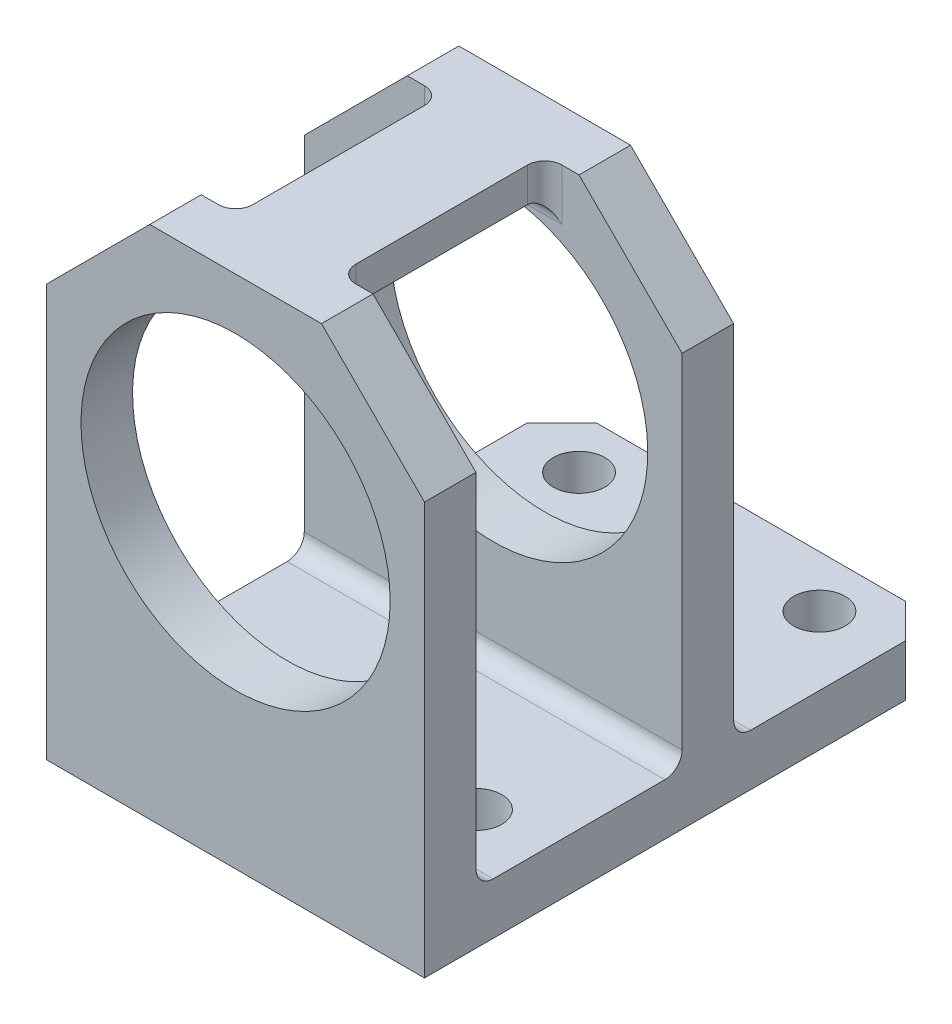
ISO-10303-21;
HEADER;
FILE_DESCRIPTION(('STEP AP214'),'2;1');
FILE_NAME('part.step','',(''),(''),'','','');
FILE_SCHEMA(('AUTOMOTIVE_DESIGN { 1 0 10303 214 1 1 1 1 }'));
ENDSEC;
DATA;
#1=APPLICATION_CONTEXT('core data for automotive mechanical design processes');
#2=APPLICATION_PROTOCOL_DEFINITION('international standard','automotive_design',2000,#1);
#3=PRODUCT_CONTEXT('',#1,'mechanical');
#4=PRODUCT('Part','Part','',(#3));
#5=PRODUCT_RELATED_PRODUCT_CATEGORY('part','',(#4));
#6=PRODUCT_DEFINITION_FORMATION('','',#4);
#7=PRODUCT_DEFINITION_CONTEXT('part definition',#1,'design');
#8=PRODUCT_DEFINITION('design','',#6,#7);
#9=PRODUCT_DEFINITION_SHAPE('','',#8);
#10=(LENGTH_UNIT() NAMED_UNIT(*) SI_UNIT(.MILLI.,.METRE.));
#11=(NAMED_UNIT(*) PLANE_ANGLE_UNIT() SI_UNIT($,.RADIAN.));
#12=(NAMED_UNIT(*) SI_UNIT($,.STERADIAN.) SOLID_ANGLE_UNIT());
#13=UNCERTAINTY_MEASURE_WITH_UNIT(LENGTH_MEASURE(1.E-05),#10,'distance_accuracy_value','');
#14=(GEOMETRIC_REPRESENTATION_CONTEXT(3) GLOBAL_UNCERTAINTY_ASSIGNED_CONTEXT((#13)) GLOBAL_UNIT_ASSIGNED_CONTEXT((#10,
#11,#12)) REPRESENTATION_CONTEXT('',''));
#15=CARTESIAN_POINT('',(0.,0.,0.));
#16=DIRECTION('',(0.,0.,1.));
#17=DIRECTION('',(1.,0.,0.));
#18=AXIS2_PLACEMENT_3D('',#15,#16,#17);
#19=CARTESIAN_POINT('',(11.,-18.,30.));
#20=DIRECTION('',(-1.,0.,0.));
#21=DIRECTION('',(0.,-1.,0.));
#22=AXIS2_PLACEMENT_3D('',#19,#20,#21);
#23=PLANE('',#22);
#24=DIRECTION('',(0.,-1.,0.));
#25=VECTOR('',#24,1.);
#26=CARTESIAN_POINT('',(11.,-15.,12.));
#27=LINE('',#26,#25);
#28=CARTESIAN_POINT('',(11.,5.99999999999999,12.));
#29=VERTEX_POINT('',#28);
#30=CARTESIAN_POINT('',(11.,-14.,12.));
#31=VERTEX_POINT('',#30);
#32=EDGE_CURVE('E423',#29,#31,#27,.T.);
#33=ORIENTED_EDGE('',*,*,#32,.F.);
#34=DIRECTION('',(0.,0.,1.));
#35=VECTOR('',#34,1.);
#36=CARTESIAN_POINT('',(11.,5.99999999999998,30.));
#37=LINE('',#36,#35);
#38=CARTESIAN_POINT('',(11.,5.99999999999998,15.));
#39=VERTEX_POINT('',#38);
#40=EDGE_CURVE('E319',#29,#39,#37,.T.);
#41=ORIENTED_EDGE('',*,*,#40,.T.);
#42=DIRECTION('',(0.,1.,0.));
#43=VECTOR('',#42,1.);
#44=CARTESIAN_POINT('',(11.,10.,15.));
#45=LINE('',#44,#43);
#46=CARTESIAN_POINT('',(11.,-14.,15.));
#47=VERTEX_POINT('',#46);
#48=EDGE_CURVE('E446',#47,#39,#45,.T.);
#49=ORIENTED_EDGE('',*,*,#48,.F.);
#50=CARTESIAN_POINT('',(11.,-14.,16.));
#51=DIRECTION('',(-1.,0.,0.));
#52=DIRECTION('',(0.,-1.,0.));
#53=AXIS2_PLACEMENT_3D('',#50,#51,#52);
#54=CIRCLE('',#53,1.);
#55=CARTESIAN_POINT('',(11.,-15.,16.));
#56=VERTEX_POINT('',#55);
#57=EDGE_CURVE('E378',#47,#56,#54,.T.);
#58=ORIENTED_EDGE('',*,*,#57,.T.);
#59=DIRECTION('',(0.,0.,-1.));
#60=VECTOR('',#59,1.);
#61=CARTESIAN_POINT('',(11.,-15.,27.));
#62=LINE('',#61,#60);
#63=CARTESIAN_POINT('',(11.,-15.,26.));
#64=VERTEX_POINT('',#63);
#65=EDGE_CURVE('E451',#64,#56,#62,.T.);
#66=ORIENTED_EDGE('',*,*,#65,.F.);
#67=CARTESIAN_POINT('',(11.,-14.,26.));
#68=DIRECTION('',(-1.,0.,0.));
#69=DIRECTION('',(0.,-1.,0.));
#70=AXIS2_PLACEMENT_3D('',#67,#68,#69);
#71=CIRCLE('',#70,1.);
#72=CARTESIAN_POINT('',(11.,-14.,27.));
#73=VERTEX_POINT('',#72);
#74=EDGE_CURVE('E44',#64,#73,#71,.T.);
#75=ORIENTED_EDGE('',*,*,#74,.T.);
#76=DIRECTION('',(0.,-1.,0.));
#77=VECTOR('',#76,1.);
#78=CARTESIAN_POINT('',(11.,10.,27.));
#79=LINE('',#78,#77);
#80=CARTESIAN_POINT('',(11.,5.99999999999998,27.));
#81=VERTEX_POINT('',#80);
#82=EDGE_CURVE('E442',#81,#73,#79,.T.);
#83=ORIENTED_EDGE('',*,*,#82,.F.);
#84=DIRECTION('',(0.,0.,1.));
#85=VECTOR('',#84,1.);
#86=CARTESIAN_POINT('',(11.,5.99999999999998,30.));
#87=LINE('',#86,#85);
#88=CARTESIAN_POINT('',(11.,5.99999999999998,30.));
#89=VERTEX_POINT('',#88);
#90=EDGE_CURVE('E317',#81,#89,#87,.T.);
#91=ORIENTED_EDGE('',*,*,#90,.T.);
#92=DIRECTION('',(0.,1.,0.));
#93=VECTOR('',#92,1.);
#94=CARTESIAN_POINT('',(11.,-18.,30.));
#95=LINE('',#94,#93);
#96=CARTESIAN_POINT('',(11.,-18.,30.));
#97=VERTEX_POINT('',#96);
#98=EDGE_CURVE('E254',#97,#89,#95,.T.);
#99=ORIENTED_EDGE('',*,*,#98,.F.);
#100=DIRECTION('',(0.,0.,-1.));
#101=VECTOR('',#100,1.);
#102=CARTESIAN_POINT('',(11.,-18.,30.));
#103=LINE('',#102,#101);
#104=CARTESIAN_POINT('',(11.,-18.,1.99999999999999));
#105=VERTEX_POINT('',#104);
#106=EDGE_CURVE('E243',#97,#105,#103,.T.);
#107=ORIENTED_EDGE('',*,*,#106,.T.);
#108=DIRECTION('',(0.,1.,0.));
#109=VECTOR('',#108,1.);
#110=CARTESIAN_POINT('',(11.,-15.,2.));
#111=LINE('',#110,#109);
#112=CARTESIAN_POINT('',(11.,-15.,1.99999999999999));
#113=VERTEX_POINT('',#112);
#114=EDGE_CURVE('E283',#105,#113,#111,.T.);
#115=ORIENTED_EDGE('',*,*,#114,.T.);
#116=DIRECTION('',(0.,0.,-1.));
#117=VECTOR('',#116,1.);
#118=CARTESIAN_POINT('',(11.,-15.,12.));
#119=LINE('',#118,#117);
#120=CARTESIAN_POINT('',(11.,-15.,11.));
#121=VERTEX_POINT('',#120);
#122=EDGE_CURVE('E427',#121,#113,#119,.T.);
#123=ORIENTED_EDGE('',*,*,#122,.F.);
#124=CARTESIAN_POINT('',(11.,-14.,11.));
#125=DIRECTION('',(-1.,0.,0.));
#126=DIRECTION('',(0.,-1.,0.));
#127=AXIS2_PLACEMENT_3D('',#124,#125,#126);
#128=CIRCLE('',#127,1.);
#129=EDGE_CURVE('E366',#121,#31,#128,.T.);
#130=ORIENTED_EDGE('',*,*,#129,.T.);
#131=EDGE_LOOP('',(#33,#41,#49,#58,#66,#75,#83,#91,#99,#107,#115,#123,#130));
#132=FACE_BOUND('',#131,.T.);
#133=ADVANCED_FACE('F35',(#132),#23,.F.);
#134=CARTESIAN_POINT('',(-11.,12.,30.));
#135=DIRECTION('',(0.,-1.,0.));
#136=DIRECTION('',(0.,0.,-1.));
#137=AXIS2_PLACEMENT_3D('',#134,#135,#136);
#138=PLANE('',#137);
#139=DIRECTION('',(-1.,0.,0.));
#140=VECTOR('',#139,1.);
#141=CARTESIAN_POINT('',(-11.,12.,12.));
#142=LINE('',#141,#140);
#143=CARTESIAN_POINT('',(5.,12.,12.));
#144=VERTEX_POINT('',#143);
#145=CARTESIAN_POINT('',(-4.99999999999997,12.,12.));
#146=VERTEX_POINT('',#145);
#147=EDGE_CURVE('E267',#144,#146,#142,.T.);
#148=ORIENTED_EDGE('',*,*,#147,.T.);
#149=DIRECTION('',(0.,0.,1.));
#150=VECTOR('',#149,1.);
#151=CARTESIAN_POINT('',(-4.99999999999997,12.,30.));
#152=LINE('',#151,#150);
#153=CARTESIAN_POINT('',(-4.99999999999997,12.,15.));
#154=VERTEX_POINT('',#153);
#155=EDGE_CURVE('E303',#146,#154,#152,.T.);
#156=ORIENTED_EDGE('',*,*,#155,.T.);
#157=DIRECTION('',(1.,0.,0.));
#158=VECTOR('',#157,1.);
#159=CARTESIAN_POINT('',(0.,12.,15.));
#160=LINE('',#159,#158);
#161=CARTESIAN_POINT('',(-4.,12.,15.));
#162=VERTEX_POINT('',#161);
#163=EDGE_CURVE('E525',#154,#162,#160,.T.);
#164=ORIENTED_EDGE('',*,*,#163,.T.);
#165=CARTESIAN_POINT('',(-4.,12.,16.));
#166=DIRECTION('',(0.,-1.,0.));
#167=DIRECTION('',(0.,0.,-1.));
#168=AXIS2_PLACEMENT_3D('',#165,#166,#167);
#169=CIRCLE('',#168,1.);
#170=CARTESIAN_POINT('',(-3.,12.,16.));
#171=VERTEX_POINT('',#170);
#172=EDGE_CURVE('E372',#162,#171,#169,.T.);
#173=ORIENTED_EDGE('',*,*,#172,.T.);
#174=DIRECTION('',(0.,0.,-1.));
#175=VECTOR('',#174,1.);
#176=CARTESIAN_POINT('',(-3.,12.,0.));
#177=LINE('',#176,#175);
#178=CARTESIAN_POINT('',(-3.,12.,26.));
#179=VERTEX_POINT('',#178);
#180=EDGE_CURVE('E524',#179,#171,#177,.T.);
#181=ORIENTED_EDGE('',*,*,#180,.F.);
#182=CARTESIAN_POINT('',(-4.,12.,26.));
#183=DIRECTION('',(0.,-1.,0.));
#184=DIRECTION('',(0.,0.,-1.));
#185=AXIS2_PLACEMENT_3D('',#182,#183,#184);
#186=CIRCLE('',#185,1.);
#187=CARTESIAN_POINT('',(-4.,12.,27.));
#188=VERTEX_POINT('',#187);
#189=EDGE_CURVE('E370',#179,#188,#186,.T.);
#190=ORIENTED_EDGE('',*,*,#189,.T.);
#191=DIRECTION('',(1.,0.,0.));
#192=VECTOR('',#191,1.);
#193=CARTESIAN_POINT('',(0.,12.,27.));
#194=LINE('',#193,#192);
#195=CARTESIAN_POINT('',(-4.99999999999997,12.,27.));
#196=VERTEX_POINT('',#195);
#197=EDGE_CURVE('E522',#196,#188,#194,.T.);
#198=ORIENTED_EDGE('',*,*,#197,.F.);
#199=DIRECTION('',(0.,0.,1.));
#200=VECTOR('',#199,1.);
#201=CARTESIAN_POINT('',(-4.99999999999997,12.,30.));
#202=LINE('',#201,#200);
#203=CARTESIAN_POINT('',(-4.99999999999997,12.,30.));
#204=VERTEX_POINT('',#203);
#205=EDGE_CURVE('E301',#196,#204,#202,.T.);
#206=ORIENTED_EDGE('',*,*,#205,.T.);
#207=DIRECTION('',(-1.,0.,0.));
#208=VECTOR('',#207,1.);
#209=CARTESIAN_POINT('',(-11.,12.,30.));
#210=LINE('',#209,#208);
#211=CARTESIAN_POINT('',(5.,12.,30.));
#212=VERTEX_POINT('',#211);
#213=EDGE_CURVE('E234',#212,#204,#210,.T.);
#214=ORIENTED_EDGE('',*,*,#213,.F.);
#215=DIRECTION('',(0.,0.,-1.));
#216=VECTOR('',#215,1.);
#217=CARTESIAN_POINT('',(5.,12.,30.));
#218=LINE('',#217,#216);
#219=CARTESIAN_POINT('',(5.,12.,27.));
#220=VERTEX_POINT('',#219);
#221=EDGE_CURVE('E295',#212,#220,#218,.T.);
#222=ORIENTED_EDGE('',*,*,#221,.T.);
#223=DIRECTION('',(-1.,0.,0.));
#224=VECTOR('',#223,1.);
#225=CARTESIAN_POINT('',(0.,12.,27.));
#226=LINE('',#225,#224);
#227=CARTESIAN_POINT('',(4.,12.,27.));
#228=VERTEX_POINT('',#227);
#229=EDGE_CURVE('E429',#220,#228,#226,.T.);
#230=ORIENTED_EDGE('',*,*,#229,.T.);
#231=CARTESIAN_POINT('',(4.,12.,26.));
#232=DIRECTION('',(0.,-1.,0.));
#233=DIRECTION('',(0.,0.,-1.));
#234=AXIS2_PLACEMENT_3D('',#231,#232,#233);
#235=CIRCLE('',#234,1.);
#236=CARTESIAN_POINT('',(3.,12.,26.));
#237=VERTEX_POINT('',#236);
#238=EDGE_CURVE('E376',#228,#237,#235,.T.);
#239=ORIENTED_EDGE('',*,*,#238,.T.);
#240=DIRECTION('',(0.,0.,-1.));
#241=VECTOR('',#240,1.);
#242=CARTESIAN_POINT('',(3.,12.,0.));
#243=LINE('',#242,#241);
#244=CARTESIAN_POINT('',(3.,12.,16.));
#245=VERTEX_POINT('',#244);
#246=EDGE_CURVE('E412',#237,#245,#243,.T.);
#247=ORIENTED_EDGE('',*,*,#246,.T.);
#248=CARTESIAN_POINT('',(4.,12.,16.));
#249=DIRECTION('',(0.,-1.,0.));
#250=DIRECTION('',(0.,0.,-1.));
#251=AXIS2_PLACEMENT_3D('',#248,#249,#250);
#252=CIRCLE('',#251,1.);
#253=CARTESIAN_POINT('',(4.,12.,15.));
#254=VERTEX_POINT('',#253);
#255=EDGE_CURVE('E374',#245,#254,#252,.T.);
#256=ORIENTED_EDGE('',*,*,#255,.T.);
#257=DIRECTION('',(-1.,0.,0.));
#258=VECTOR('',#257,1.);
#259=CARTESIAN_POINT('',(0.,12.,15.));
#260=LINE('',#259,#258);
#261=CARTESIAN_POINT('',(5.,12.,15.));
#262=VERTEX_POINT('',#261);
#263=EDGE_CURVE('E424',#262,#254,#260,.T.);
#264=ORIENTED_EDGE('',*,*,#263,.F.);
#265=DIRECTION('',(0.,0.,-1.));
#266=VECTOR('',#265,1.);
#267=CARTESIAN_POINT('',(5.,12.,30.));
#268=LINE('',#267,#266);
#269=EDGE_CURVE('E298',#262,#144,#268,.T.);
#270=ORIENTED_EDGE('',*,*,#269,.T.);
#271=EDGE_LOOP('',(#148,#156,#164,#173,#181,#190,#198,#206,#214,#222,#230,#239,#247,#256,#264,#270));
#272=FACE_BOUND('',#271,.T.);
#273=ADVANCED_FACE('F418',(#272),#138,.F.);
#274=CARTESIAN_POINT('',(-11.,10.,27.));
#275=DIRECTION('',(0.,1.,0.));
#276=DIRECTION('',(-1.,0.,0.));
#277=AXIS2_PLACEMENT_3D('',#274,#275,#276);
#278=PLANE('',#277);
#279=DIRECTION('',(0.,0.,1.));
#280=VECTOR('',#279,1.);
#281=CARTESIAN_POINT('',(-3.,10.,0.));
#282=LINE('',#281,#280);
#283=CARTESIAN_POINT('',(-3.,10.,16.));
#284=VERTEX_POINT('',#283);
#285=CARTESIAN_POINT('',(-3.,10.,26.));
#286=VERTEX_POINT('',#285);
#287=EDGE_CURVE('E519',#284,#286,#282,.T.);
#288=ORIENTED_EDGE('',*,*,#287,.F.);
#289=DIRECTION('',(1.,0.,0.));
#290=VECTOR('',#289,1.);
#291=CARTESIAN_POINT('',(3.,10.,16.));
#292=LINE('',#291,#290);
#293=CARTESIAN_POINT('',(3.,10.,16.));
#294=VERTEX_POINT('',#293);
#295=EDGE_CURVE('E364',#284,#294,#292,.T.);
#296=ORIENTED_EDGE('',*,*,#295,.T.);
#297=DIRECTION('',(0.,0.,1.));
#298=VECTOR('',#297,1.);
#299=CARTESIAN_POINT('',(3.,10.,0.));
#300=LINE('',#299,#298);
#301=CARTESIAN_POINT('',(3.,10.,26.));
#302=VERTEX_POINT('',#301);
#303=EDGE_CURVE('E415',#294,#302,#300,.T.);
#304=ORIENTED_EDGE('',*,*,#303,.T.);
#305=DIRECTION('',(1.,0.,0.));
#306=VECTOR('',#305,1.);
#307=CARTESIAN_POINT('',(-3.,10.,26.));
#308=LINE('',#307,#306);
#309=EDGE_CURVE('E362',#302,#286,#308,.F.);
#310=ORIENTED_EDGE('',*,*,#309,.T.);
#311=EDGE_LOOP('',(#288,#296,#304,#310));
#312=FACE_BOUND('',#311,.T.);
#313=ADVANCED_FACE('F591',(#312),#278,.F.);
#314=CARTESIAN_POINT('',(0.,0.,30.));
#315=DIRECTION('',(0.,0.,-1.));
#316=DIRECTION('',(-1.,0.,0.));
#317=AXIS2_PLACEMENT_3D('',#314,#315,#316);
#318=CYLINDRICAL_SURFACE('',#317,9.);
#319=CARTESIAN_POINT('',(0.,0.,27.));
#320=DIRECTION('',(0.,0.,1.));
#321=DIRECTION('',(0.,-1.,0.));
#322=AXIS2_PLACEMENT_3D('',#319,#320,#321);
#323=CIRCLE('',#322,9.);
#324=CARTESIAN_POINT('',(0.,9.,27.));
#325=VERTEX_POINT('',#324);
#326=EDGE_CURVE('E260',#325,#325,#323,.T.);
#327=ORIENTED_EDGE('',*,*,#326,.F.);
#328=EDGE_LOOP('',(#327));
#329=FACE_BOUND('',#328,.T.);
#330=CARTESIAN_POINT('',(0.,0.,30.));
#331=DIRECTION('',(0.,0.,1.));
#332=DIRECTION('',(1.,0.,0.));
#333=AXIS2_PLACEMENT_3D('',#330,#331,#332);
#334=CIRCLE('',#333,9.);
#335=CARTESIAN_POINT('',(9.,0.,30.));
#336=VERTEX_POINT('',#335);
#337=EDGE_CURVE('E255',#336,#336,#334,.T.);
#338=ORIENTED_EDGE('',*,*,#337,.T.);
#339=EDGE_LOOP('',(#338));
#340=FACE_BOUND('',#339,.T.);
#341=ADVANCED_FACE('F754',(#329,#340),#318,.F.);
#342=CARTESIAN_POINT('',(0.,0.,30.));
#343=DIRECTION('',(0.,0.,-1.));
#344=DIRECTION('',(-1.,0.,0.));
#345=AXIS2_PLACEMENT_3D('',#342,#343,#344);
#346=PLANE('',#345);
#347=ORIENTED_EDGE('',*,*,#213,.T.);
#348=DIRECTION('',(0.707106781186549,0.707106781186546,0.));
#349=VECTOR('',#348,1.);
#350=CARTESIAN_POINT('',(-11.,6.,30.));
#351=LINE('',#350,#349);
#352=CARTESIAN_POINT('',(-11.,6.,30.));
#353=VERTEX_POINT('',#352);
#354=EDGE_CURVE('E231',#204,#353,#351,.F.);
#355=ORIENTED_EDGE('',*,*,#354,.T.);
#356=DIRECTION('',(0.,-1.,0.));
#357=VECTOR('',#356,1.);
#358=CARTESIAN_POINT('',(-11.,-18.,30.));
#359=LINE('',#358,#357);
#360=CARTESIAN_POINT('',(-11.,-18.,30.));
#361=VERTEX_POINT('',#360);
#362=EDGE_CURVE('E221',#353,#361,#359,.T.);
#363=ORIENTED_EDGE('',*,*,#362,.T.);
#364=DIRECTION('',(1.,0.,0.));
#365=VECTOR('',#364,1.);
#366=CARTESIAN_POINT('',(-11.,-18.,30.));
#367=LINE('',#366,#365);
#368=EDGE_CURVE('E228',#361,#97,#367,.T.);
#369=ORIENTED_EDGE('',*,*,#368,.T.);
#370=ORIENTED_EDGE('',*,*,#98,.T.);
#371=DIRECTION('',(0.707106781186547,-0.707106781186549,0.));
#372=VECTOR('',#371,1.);
#373=CARTESIAN_POINT('',(5.,12.,30.));
#374=LINE('',#373,#372);
#375=EDGE_CURVE('E314',#89,#212,#374,.F.);
#376=ORIENTED_EDGE('',*,*,#375,.T.);
#377=EDGE_LOOP('',(#347,#355,#363,#369,#370,#376));
#378=FACE_BOUND('',#377,.T.);
#379=ORIENTED_EDGE('',*,*,#337,.F.);
#380=EDGE_LOOP('',(#379));
#381=FACE_BOUND('',#380,.T.);
#382=ADVANCED_FACE('F224',(#378,#381),#346,.F.);
#383=CARTESIAN_POINT('',(0.,0.,0.));
#384=DIRECTION('',(0.,0.,-1.));
#385=DIRECTION('',(-1.,0.,0.));
#386=AXIS2_PLACEMENT_3D('',#383,#384,#385);
#387=PLANE('',#386);
#388=DIRECTION('',(1.,0.,0.));
#389=VECTOR('',#388,1.);
#390=CARTESIAN_POINT('',(-11.,-18.,0.));
#391=LINE('',#390,#389);
#392=CARTESIAN_POINT('',(-8.99999999999999,-18.,0.));
#393=VERTEX_POINT('',#392);
#394=CARTESIAN_POINT('',(9.00000000000001,-18.,0.));
#395=VERTEX_POINT('',#394);
#396=EDGE_CURVE('E252',#393,#395,#391,.T.);
#397=ORIENTED_EDGE('',*,*,#396,.F.);
#398=DIRECTION('',(0.,1.,0.));
#399=VECTOR('',#398,1.);
#400=CARTESIAN_POINT('',(-8.99999999999999,-15.,0.));
#401=LINE('',#400,#399);
#402=CARTESIAN_POINT('',(-8.99999999999999,-15.,0.));
#403=VERTEX_POINT('',#402);
#404=EDGE_CURVE('E276',#393,#403,#401,.T.);
#405=ORIENTED_EDGE('',*,*,#404,.T.);
#406=DIRECTION('',(1.,0.,0.));
#407=VECTOR('',#406,1.);
#408=CARTESIAN_POINT('',(-11.,-15.,0.));
#409=LINE('',#408,#407);
#410=CARTESIAN_POINT('',(9.00000000000001,-15.,0.));
#411=VERTEX_POINT('',#410);
#412=EDGE_CURVE('E268',#403,#411,#409,.T.);
#413=ORIENTED_EDGE('',*,*,#412,.T.);
#414=DIRECTION('',(0.,-1.,0.));
#415=VECTOR('',#414,1.);
#416=CARTESIAN_POINT('',(9.00000000000001,-18.,0.));
#417=LINE('',#416,#415);
#418=EDGE_CURVE('E274',#411,#395,#417,.T.);
#419=ORIENTED_EDGE('',*,*,#418,.T.);
#420=EDGE_LOOP('',(#397,#405,#413,#419));
#421=FACE_BOUND('',#420,.T.);
#422=ADVANCED_FACE('F508',(#421),#387,.T.);
#423=CARTESIAN_POINT('',(-11.,-18.,30.));
#424=DIRECTION('',(1.,0.,0.));
#425=DIRECTION('',(0.,1.,0.));
#426=AXIS2_PLACEMENT_3D('',#423,#424,#425);
#427=PLANE('',#426);
#428=DIRECTION('',(0.,0.,-1.));
#429=VECTOR('',#428,1.);
#430=CARTESIAN_POINT('',(-11.,-15.,27.));
#431=LINE('',#430,#429);
#432=CARTESIAN_POINT('',(-11.,-15.,26.));
#433=VERTEX_POINT('',#432);
#434=CARTESIAN_POINT('',(-11.,-15.,16.));
#435=VERTEX_POINT('',#434);
#436=EDGE_CURVE('E445',#433,#435,#431,.T.);
#437=ORIENTED_EDGE('',*,*,#436,.T.);
#438=CARTESIAN_POINT('',(-11.,-14.,16.));
#439=DIRECTION('',(1.,0.,0.));
#440=DIRECTION('',(0.,1.,0.));
#441=AXIS2_PLACEMENT_3D('',#438,#439,#440);
#442=CIRCLE('',#441,1.);
#443=CARTESIAN_POINT('',(-11.,-14.,15.));
#444=VERTEX_POINT('',#443);
#445=EDGE_CURVE('E380',#435,#444,#442,.T.);
#446=ORIENTED_EDGE('',*,*,#445,.T.);
#447=DIRECTION('',(0.,1.,0.));
#448=VECTOR('',#447,1.);
#449=CARTESIAN_POINT('',(-11.,10.,15.));
#450=LINE('',#449,#448);
#451=CARTESIAN_POINT('',(-11.,6.,15.));
#452=VERTEX_POINT('',#451);
#453=EDGE_CURVE('E261',#444,#452,#450,.T.);
#454=ORIENTED_EDGE('',*,*,#453,.T.);
#455=DIRECTION('',(0.,0.,-1.));
#456=VECTOR('',#455,1.);
#457=CARTESIAN_POINT('',(-11.,6.,30.));
#458=LINE('',#457,#456);
#459=CARTESIAN_POINT('',(-11.,6.,12.));
#460=VERTEX_POINT('',#459);
#461=EDGE_CURVE('E288',#452,#460,#458,.T.);
#462=ORIENTED_EDGE('',*,*,#461,.T.);
#463=DIRECTION('',(0.,-1.,0.));
#464=VECTOR('',#463,1.);
#465=CARTESIAN_POINT('',(-11.,-15.,12.));
#466=LINE('',#465,#464);
#467=CARTESIAN_POINT('',(-11.,-14.,12.));
#468=VERTEX_POINT('',#467);
#469=EDGE_CURVE('E433',#460,#468,#466,.T.);
#470=ORIENTED_EDGE('',*,*,#469,.T.);
#471=CARTESIAN_POINT('',(-11.,-14.,11.));
#472=DIRECTION('',(1.,0.,0.));
#473=DIRECTION('',(0.,1.,0.));
#474=AXIS2_PLACEMENT_3D('',#471,#472,#473);
#475=CIRCLE('',#474,1.);
#476=CARTESIAN_POINT('',(-11.,-15.,11.));
#477=VERTEX_POINT('',#476);
#478=EDGE_CURVE('E368',#468,#477,#475,.T.);
#479=ORIENTED_EDGE('',*,*,#478,.T.);
#480=DIRECTION('',(0.,0.,-1.));
#481=VECTOR('',#480,1.);
#482=CARTESIAN_POINT('',(-11.,-15.,12.));
#483=LINE('',#482,#481);
#484=CARTESIAN_POINT('',(-11.,-15.,1.99999999999999));
#485=VERTEX_POINT('',#484);
#486=EDGE_CURVE('E436',#477,#485,#483,.T.);
#487=ORIENTED_EDGE('',*,*,#486,.T.);
#488=DIRECTION('',(0.,-1.,0.));
#489=VECTOR('',#488,1.);
#490=CARTESIAN_POINT('',(-11.,-18.,1.99999999999999));
#491=LINE('',#490,#489);
#492=CARTESIAN_POINT('',(-11.,-18.,1.99999999999999));
#493=VERTEX_POINT('',#492);
#494=EDGE_CURVE('E241',#485,#493,#491,.T.);
#495=ORIENTED_EDGE('',*,*,#494,.T.);
#496=DIRECTION('',(0.,0.,-1.));
#497=VECTOR('',#496,1.);
#498=CARTESIAN_POINT('',(-11.,-18.,30.));
#499=LINE('',#498,#497);
#500=EDGE_CURVE('E238',#361,#493,#499,.T.);
#501=ORIENTED_EDGE('',*,*,#500,.F.);
#502=ORIENTED_EDGE('',*,*,#362,.F.);
#503=DIRECTION('',(0.,0.,-1.));
#504=VECTOR('',#503,1.);
#505=CARTESIAN_POINT('',(-11.,6.,30.));
#506=LINE('',#505,#504);
#507=CARTESIAN_POINT('',(-11.,6.,27.));
#508=VERTEX_POINT('',#507);
#509=EDGE_CURVE('E286',#353,#508,#506,.T.);
#510=ORIENTED_EDGE('',*,*,#509,.T.);
#511=DIRECTION('',(0.,-1.,0.));
#512=VECTOR('',#511,1.);
#513=CARTESIAN_POINT('',(-11.,10.,27.));
#514=LINE('',#513,#512);
#515=CARTESIAN_POINT('',(-11.,-14.,27.));
#516=VERTEX_POINT('',#515);
#517=EDGE_CURVE('E443',#508,#516,#514,.T.);
#518=ORIENTED_EDGE('',*,*,#517,.T.);
#519=CARTESIAN_POINT('',(-11.,-14.,26.));
#520=DIRECTION('',(1.,0.,0.));
#521=DIRECTION('',(0.,1.,0.));
#522=AXIS2_PLACEMENT_3D('',#519,#520,#521);
#523=CIRCLE('',#522,1.);
#524=EDGE_CURVE('E11',#516,#433,#523,.T.);
#525=ORIENTED_EDGE('',*,*,#524,.T.);
#526=EDGE_LOOP('',(#437,#446,#454,#462,#470,#479,#487,#495,#501,#502,#510,#518,#525));
#527=FACE_BOUND('',#526,.T.);
#528=ADVANCED_FACE('F239',(#527),#427,.F.);
#529=CARTESIAN_POINT('',(-11.,-18.,30.));
#530=DIRECTION('',(0.,1.,0.));
#531=DIRECTION('',(0.,0.,1.));
#532=AXIS2_PLACEMENT_3D('',#529,#530,#531);
#533=PLANE('',#532);
#534=CARTESIAN_POINT('',(-7.,-18.,23.));
#535=DIRECTION('',(0.,1.,0.));
#536=DIRECTION('',(1.,0.,0.));
#537=AXIS2_PLACEMENT_3D('',#534,#535,#536);
#538=CIRCLE('',#537,1.5);
#539=CARTESIAN_POINT('',(-5.49999999999999,-18.,23.));
#540=VERTEX_POINT('',#539);
#541=EDGE_CURVE('E548',#540,#540,#538,.T.);
#542=ORIENTED_EDGE('',*,*,#541,.T.);
#543=EDGE_LOOP('',(#542));
#544=FACE_BOUND('',#543,.T.);
#545=CARTESIAN_POINT('',(-7.,-18.,3.));
#546=DIRECTION('',(0.,1.,0.));
#547=DIRECTION('',(1.,0.,0.));
#548=AXIS2_PLACEMENT_3D('',#545,#546,#547);
#549=CIRCLE('',#548,1.5);
#550=CARTESIAN_POINT('',(-5.5,-18.,3.));
#551=VERTEX_POINT('',#550);
#552=EDGE_CURVE('E542',#551,#551,#549,.T.);
#553=ORIENTED_EDGE('',*,*,#552,.T.);
#554=EDGE_LOOP('',(#553));
#555=FACE_BOUND('',#554,.T.);
#556=CARTESIAN_POINT('',(7.,-18.,3.));
#557=DIRECTION('',(0.,1.,0.));
#558=DIRECTION('',(-1.,0.,0.));
#559=AXIS2_PLACEMENT_3D('',#556,#557,#558);
#560=CIRCLE('',#559,1.5);
#561=CARTESIAN_POINT('',(5.50000000000001,-18.,3.));
#562=VERTEX_POINT('',#561);
#563=EDGE_CURVE('E536',#562,#562,#560,.T.);
#564=ORIENTED_EDGE('',*,*,#563,.T.);
#565=EDGE_LOOP('',(#564));
#566=FACE_BOUND('',#565,.T.);
#567=CARTESIAN_POINT('',(7.,-18.,23.));
#568=DIRECTION('',(0.,1.,0.));
#569=DIRECTION('',(-1.,0.,0.));
#570=AXIS2_PLACEMENT_3D('',#567,#568,#569);
#571=CIRCLE('',#570,1.5);
#572=CARTESIAN_POINT('',(5.50000000000001,-18.,23.));
#573=VERTEX_POINT('',#572);
#574=EDGE_CURVE('E530',#573,#573,#571,.T.);
#575=ORIENTED_EDGE('',*,*,#574,.T.);
#576=EDGE_LOOP('',(#575));
#577=FACE_BOUND('',#576,.T.);
#578=ORIENTED_EDGE('',*,*,#500,.T.);
#579=DIRECTION('',(0.707106781186549,0.,-0.707106781186546));
#580=VECTOR('',#579,1.);
#581=CARTESIAN_POINT('',(-11.,-18.,1.99999999999999));
#582=LINE('',#581,#580);
#583=EDGE_CURVE('E272',#493,#393,#582,.T.);
#584=ORIENTED_EDGE('',*,*,#583,.T.);
#585=ORIENTED_EDGE('',*,*,#396,.T.);
#586=DIRECTION('',(0.707106781186549,0.,0.707106781186546));
#587=VECTOR('',#586,1.);
#588=CARTESIAN_POINT('',(11.,-18.,1.99999999999999));
#589=LINE('',#588,#587);
#590=EDGE_CURVE('E270',#395,#105,#589,.T.);
#591=ORIENTED_EDGE('',*,*,#590,.T.);
#592=ORIENTED_EDGE('',*,*,#106,.F.);
#593=ORIENTED_EDGE('',*,*,#368,.F.);
#594=EDGE_LOOP('',(#578,#584,#585,#591,#592,#593));
#595=FACE_BOUND('',#594,.T.);
#596=ADVANCED_FACE('F245',(#544,#555,#566,#577,#595),#533,.F.);
#597=CARTESIAN_POINT('',(0.,0.,12.));
#598=DIRECTION('',(0.,0.,1.));
#599=DIRECTION('',(1.,0.,0.));
#600=AXIS2_PLACEMENT_3D('',#597,#598,#599);
#601=CIRCLE('',#600,9.);
#602=CARTESIAN_POINT('',(9.,0.,12.));
#603=VERTEX_POINT('',#602);
#604=EDGE_CURVE('E264',#603,#603,#601,.T.);
#605=ORIENTED_EDGE('',*,*,#604,.F.);
#606=EDGE_LOOP('',(#605));
#607=FACE_BOUND('',#606,.T.);
#608=CARTESIAN_POINT('',(0.,0.,15.));
#609=DIRECTION('',(0.,0.,-1.));
#610=DIRECTION('',(0.,1.,0.));
#611=AXIS2_PLACEMENT_3D('',#608,#609,#610);
#612=CIRCLE('',#611,9.);
#613=CARTESIAN_POINT('',(0.,9.,15.));
#614=VERTEX_POINT('',#613);
#615=EDGE_CURVE('E257',#614,#614,#612,.T.);
#616=ORIENTED_EDGE('',*,*,#615,.F.);
#617=EDGE_LOOP('',(#616));
#618=FACE_BOUND('',#617,.T.);
#619=ADVANCED_FACE('F743',(#607,#618),#318,.F.);
#620=CARTESIAN_POINT('',(-11.,10.,27.));
#621=DIRECTION('',(0.,0.,1.));
#622=DIRECTION('',(0.,-1.,0.));
#623=AXIS2_PLACEMENT_3D('',#620,#621,#622);
#624=PLANE('',#623);
#625=ORIENTED_EDGE('',*,*,#82,.T.);
#626=DIRECTION('',(1.,0.,0.));
#627=VECTOR('',#626,1.);
#628=CARTESIAN_POINT('',(-11.,-14.,27.));
#629=LINE('',#628,#627);
#630=EDGE_CURVE('E340',#73,#516,#629,.F.);
#631=ORIENTED_EDGE('',*,*,#630,.T.);
#632=ORIENTED_EDGE('',*,*,#517,.F.);
#633=DIRECTION('',(-0.707106781186549,-0.707106781186546,0.));
#634=VECTOR('',#633,1.);
#635=CARTESIAN_POINT('',(-11.,6.,27.));
#636=LINE('',#635,#634);
#637=EDGE_CURVE('E312',#508,#196,#636,.F.);
#638=ORIENTED_EDGE('',*,*,#637,.T.);
#639=ORIENTED_EDGE('',*,*,#197,.T.);
#640=DIRECTION('',(0.,1.,0.));
#641=VECTOR('',#640,1.);
#642=CARTESIAN_POINT('',(-4.,10.,27.));
#643=LINE('',#642,#641);
#644=CARTESIAN_POINT('',(-4.,9.,27.));
#645=VERTEX_POINT('',#644);
#646=EDGE_CURVE('E338',#188,#645,#643,.F.);
#647=ORIENTED_EDGE('',*,*,#646,.T.);
#648=DIRECTION('',(1.,0.,0.));
#649=VECTOR('',#648,1.);
#650=CARTESIAN_POINT('',(3.,9.,27.));
#651=LINE('',#650,#649);
#652=EDGE_CURVE('E334',#645,#325,#651,.T.);
#653=ORIENTED_EDGE('',*,*,#652,.T.);
#654=ORIENTED_EDGE('',*,*,#326,.T.);
#655=DIRECTION('',(1.,0.,0.));
#656=VECTOR('',#655,1.);
#657=CARTESIAN_POINT('',(3.,9.,27.));
#658=LINE('',#657,#656);
#659=CARTESIAN_POINT('',(4.,9.,27.));
#660=VERTEX_POINT('',#659);
#661=EDGE_CURVE('E332',#325,#660,#658,.T.);
#662=ORIENTED_EDGE('',*,*,#661,.T.);
#663=DIRECTION('',(0.,1.,0.));
#664=VECTOR('',#663,1.);
#665=CARTESIAN_POINT('',(4.,10.,27.));
#666=LINE('',#665,#664);
#667=EDGE_CURVE('E336',#660,#228,#666,.T.);
#668=ORIENTED_EDGE('',*,*,#667,.T.);
#669=ORIENTED_EDGE('',*,*,#229,.F.);
#670=DIRECTION('',(-0.707106781186547,0.707106781186549,0.));
#671=VECTOR('',#670,1.);
#672=CARTESIAN_POINT('',(5.,12.,27.));
#673=LINE('',#672,#671);
#674=EDGE_CURVE('E310',#220,#81,#673,.F.);
#675=ORIENTED_EDGE('',*,*,#674,.T.);
#676=EDGE_LOOP('',(#625,#631,#632,#638,#639,#647,#653,#654,#662,#668,#669,#675));
#677=FACE_BOUND('',#676,.T.);
#678=ADVANCED_FACE('F464',(#677),#624,.F.);
#679=CARTESIAN_POINT('',(-11.,10.,15.));
#680=DIRECTION('',(0.,0.,-1.));
#681=DIRECTION('',(0.,1.,0.));
#682=AXIS2_PLACEMENT_3D('',#679,#680,#681);
#683=PLANE('',#682);
#684=ORIENTED_EDGE('',*,*,#453,.F.);
#685=DIRECTION('',(1.,0.,0.));
#686=VECTOR('',#685,1.);
#687=CARTESIAN_POINT('',(11.,-14.,15.));
#688=LINE('',#687,#686);
#689=EDGE_CURVE('E351',#444,#47,#688,.T.);
#690=ORIENTED_EDGE('',*,*,#689,.T.);
#691=ORIENTED_EDGE('',*,*,#48,.T.);
#692=DIRECTION('',(0.707106781186547,-0.707106781186549,0.));
#693=VECTOR('',#692,1.);
#694=CARTESIAN_POINT('',(5.,12.,15.));
#695=LINE('',#694,#693);
#696=EDGE_CURVE('E305',#39,#262,#695,.F.);
#697=ORIENTED_EDGE('',*,*,#696,.T.);
#698=ORIENTED_EDGE('',*,*,#263,.T.);
#699=DIRECTION('',(0.,1.,0.));
#700=VECTOR('',#699,1.);
#701=CARTESIAN_POINT('',(4.,10.,15.));
#702=LINE('',#701,#700);
#703=CARTESIAN_POINT('',(4.,9.,15.));
#704=VERTEX_POINT('',#703);
#705=EDGE_CURVE('E346',#254,#704,#702,.F.);
#706=ORIENTED_EDGE('',*,*,#705,.T.);
#707=DIRECTION('',(1.,0.,0.));
#708=VECTOR('',#707,1.);
#709=CARTESIAN_POINT('',(-3.,9.,15.));
#710=LINE('',#709,#708);
#711=EDGE_CURVE('E344',#704,#614,#710,.F.);
#712=ORIENTED_EDGE('',*,*,#711,.T.);
#713=ORIENTED_EDGE('',*,*,#615,.T.);
#714=DIRECTION('',(1.,0.,0.));
#715=VECTOR('',#714,1.);
#716=CARTESIAN_POINT('',(-3.,9.,15.));
#717=LINE('',#716,#715);
#718=CARTESIAN_POINT('',(-4.,9.,15.));
#719=VERTEX_POINT('',#718);
#720=EDGE_CURVE('E342',#614,#719,#717,.F.);
#721=ORIENTED_EDGE('',*,*,#720,.T.);
#722=DIRECTION('',(0.,1.,0.));
#723=VECTOR('',#722,1.);
#724=CARTESIAN_POINT('',(-4.,12.,15.));
#725=LINE('',#724,#723);
#726=EDGE_CURVE('E348',#719,#162,#725,.T.);
#727=ORIENTED_EDGE('',*,*,#726,.T.);
#728=ORIENTED_EDGE('',*,*,#163,.F.);
#729=DIRECTION('',(0.707106781186549,0.707106781186546,0.));
#730=VECTOR('',#729,1.);
#731=CARTESIAN_POINT('',(-11.,6.,15.));
#732=LINE('',#731,#730);
#733=EDGE_CURVE('E307',#154,#452,#732,.F.);
#734=ORIENTED_EDGE('',*,*,#733,.T.);
#735=EDGE_LOOP('',(#684,#690,#691,#697,#698,#706,#712,#713,#721,#727,#728,#734));
#736=FACE_BOUND('',#735,.T.);
#737=ADVANCED_FACE('F482',(#736),#683,.F.);
#738=CARTESIAN_POINT('',(-11.,-15.,27.));
#739=DIRECTION('',(0.,-1.,0.));
#740=DIRECTION('',(1.,0.,0.));
#741=AXIS2_PLACEMENT_3D('',#738,#739,#740);
#742=PLANE('',#741);
#743=CARTESIAN_POINT('',(-7.,-15.,23.));
#744=DIRECTION('',(0.,1.,0.));
#745=DIRECTION('',(1.,0.,0.));
#746=AXIS2_PLACEMENT_3D('',#743,#744,#745);
#747=CIRCLE('',#746,1.5);
#748=CARTESIAN_POINT('',(-5.5,-15.,23.));
#749=VERTEX_POINT('',#748);
#750=EDGE_CURVE('E388',#749,#749,#747,.T.);
#751=ORIENTED_EDGE('',*,*,#750,.F.);
#752=EDGE_LOOP('',(#751));
#753=FACE_BOUND('',#752,.T.);
#754=CARTESIAN_POINT('',(7.,-15.,23.));
#755=DIRECTION('',(0.,1.,0.));
#756=DIRECTION('',(-1.,0.,0.));
#757=AXIS2_PLACEMENT_3D('',#754,#755,#756);
#758=CIRCLE('',#757,1.5);
#759=CARTESIAN_POINT('',(5.5,-15.,23.));
#760=VERTEX_POINT('',#759);
#761=EDGE_CURVE('E533',#760,#760,#758,.T.);
#762=ORIENTED_EDGE('',*,*,#761,.F.);
#763=EDGE_LOOP('',(#762));
#764=FACE_BOUND('',#763,.T.);
#765=ORIENTED_EDGE('',*,*,#65,.T.);
#766=DIRECTION('',(1.,0.,0.));
#767=VECTOR('',#766,1.);
#768=CARTESIAN_POINT('',(-11.,-15.,16.));
#769=LINE('',#768,#767);
#770=EDGE_CURVE('E52',#56,#435,#769,.F.);
#771=ORIENTED_EDGE('',*,*,#770,.T.);
#772=ORIENTED_EDGE('',*,*,#436,.F.);
#773=DIRECTION('',(1.,0.,0.));
#774=VECTOR('',#773,1.);
#775=CARTESIAN_POINT('',(11.,-15.,26.));
#776=LINE('',#775,#774);
#777=EDGE_CURVE('E358',#433,#64,#776,.T.);
#778=ORIENTED_EDGE('',*,*,#777,.T.);
#779=EDGE_LOOP('',(#765,#771,#772,#778));
#780=FACE_BOUND('',#779,.T.);
#781=ADVANCED_FACE('F472',(#753,#764,#780),#742,.F.);
#782=CARTESIAN_POINT('',(-11.,-15.,12.));
#783=DIRECTION('',(0.,0.,1.));
#784=DIRECTION('',(1.,0.,0.));
#785=AXIS2_PLACEMENT_3D('',#782,#783,#784);
#786=PLANE('',#785);
#787=ORIENTED_EDGE('',*,*,#604,.T.);
#788=EDGE_LOOP('',(#787));
#789=FACE_BOUND('',#788,.T.);
#790=ORIENTED_EDGE('',*,*,#32,.T.);
#791=DIRECTION('',(1.,0.,0.));
#792=VECTOR('',#791,1.);
#793=CARTESIAN_POINT('',(-11.,-14.,12.));
#794=LINE('',#793,#792);
#795=EDGE_CURVE('E325',#31,#468,#794,.F.);
#796=ORIENTED_EDGE('',*,*,#795,.T.);
#797=ORIENTED_EDGE('',*,*,#469,.F.);
#798=DIRECTION('',(-0.707106781186549,-0.707106781186546,0.));
#799=VECTOR('',#798,1.);
#800=CARTESIAN_POINT('',(-11.,6.,12.));
#801=LINE('',#800,#799);
#802=EDGE_CURVE('E293',#460,#146,#801,.F.);
#803=ORIENTED_EDGE('',*,*,#802,.T.);
#804=ORIENTED_EDGE('',*,*,#147,.F.);
#805=DIRECTION('',(-0.707106781186547,0.707106781186549,0.));
#806=VECTOR('',#805,1.);
#807=CARTESIAN_POINT('',(5.,12.,12.));
#808=LINE('',#807,#806);
#809=EDGE_CURVE('E291',#144,#29,#808,.F.);
#810=ORIENTED_EDGE('',*,*,#809,.T.);
#811=EDGE_LOOP('',(#790,#796,#797,#803,#804,#810));
#812=FACE_BOUND('',#811,.T.);
#813=ADVANCED_FACE('F490',(#789,#812),#786,.F.);
#814=CARTESIAN_POINT('',(-11.,-15.,12.));
#815=DIRECTION('',(0.,-1.,0.));
#816=DIRECTION('',(1.,0.,0.));
#817=AXIS2_PLACEMENT_3D('',#814,#815,#816);
#818=PLANE('',#817);
#819=CARTESIAN_POINT('',(-7.,-15.,3.));
#820=DIRECTION('',(0.,1.,0.));
#821=DIRECTION('',(1.,0.,0.));
#822=AXIS2_PLACEMENT_3D('',#819,#820,#821);
#823=CIRCLE('',#822,1.5);
#824=CARTESIAN_POINT('',(-5.5,-15.,3.));
#825=VERTEX_POINT('',#824);
#826=EDGE_CURVE('E545',#825,#825,#823,.T.);
#827=ORIENTED_EDGE('',*,*,#826,.F.);
#828=EDGE_LOOP('',(#827));
#829=FACE_BOUND('',#828,.T.);
#830=CARTESIAN_POINT('',(7.,-15.,3.));
#831=DIRECTION('',(0.,1.,0.));
#832=DIRECTION('',(-1.,0.,0.));
#833=AXIS2_PLACEMENT_3D('',#830,#831,#832);
#834=CIRCLE('',#833,1.5);
#835=CARTESIAN_POINT('',(5.5,-15.,3.));
#836=VERTEX_POINT('',#835);
#837=EDGE_CURVE('E539',#836,#836,#834,.T.);
#838=ORIENTED_EDGE('',*,*,#837,.F.);
#839=EDGE_LOOP('',(#838));
#840=FACE_BOUND('',#839,.T.);
#841=ORIENTED_EDGE('',*,*,#486,.F.);
#842=DIRECTION('',(1.,0.,0.));
#843=VECTOR('',#842,1.);
#844=CARTESIAN_POINT('',(11.,-15.,11.));
#845=LINE('',#844,#843);
#846=EDGE_CURVE('E322',#477,#121,#845,.T.);
#847=ORIENTED_EDGE('',*,*,#846,.T.);
#848=ORIENTED_EDGE('',*,*,#122,.T.);
#849=DIRECTION('',(-0.707106781186549,0.,-0.707106781186546));
#850=VECTOR('',#849,1.);
#851=CARTESIAN_POINT('',(11.,-15.,1.99999999999999));
#852=LINE('',#851,#850);
#853=EDGE_CURVE('E278',#113,#411,#852,.T.);
#854=ORIENTED_EDGE('',*,*,#853,.T.);
#855=ORIENTED_EDGE('',*,*,#412,.F.);
#856=DIRECTION('',(-0.707106781186549,0.,0.707106781186546));
#857=VECTOR('',#856,1.);
#858=CARTESIAN_POINT('',(-11.,-15.,1.99999999999999));
#859=LINE('',#858,#857);
#860=EDGE_CURVE('E280',#403,#485,#859,.T.);
#861=ORIENTED_EDGE('',*,*,#860,.T.);
#862=EDGE_LOOP('',(#841,#847,#848,#854,#855,#861));
#863=FACE_BOUND('',#862,.T.);
#864=ADVANCED_FACE('F498',(#829,#840,#863),#818,.F.);
#865=CARTESIAN_POINT('',(-11.,-18.,1.99999999999999));
#866=DIRECTION('',(-0.707106781186546,0.,-0.707106781186549));
#867=DIRECTION('',(0.,1.,0.));
#868=AXIS2_PLACEMENT_3D('',#865,#866,#867);
#869=PLANE('',#868);
#870=ORIENTED_EDGE('',*,*,#860,.F.);
#871=ORIENTED_EDGE('',*,*,#404,.F.);
#872=ORIENTED_EDGE('',*,*,#583,.F.);
#873=ORIENTED_EDGE('',*,*,#494,.F.);
#874=EDGE_LOOP('',(#870,#871,#872,#873));
#875=FACE_BOUND('',#874,.T.);
#876=ADVANCED_FACE('F504',(#875),#869,.T.);
#877=CARTESIAN_POINT('',(11.,-18.,1.99999999999999));
#878=DIRECTION('',(0.707106781186546,0.,-0.707106781186549));
#879=DIRECTION('',(0.,-1.,0.));
#880=AXIS2_PLACEMENT_3D('',#877,#878,#879);
#881=PLANE('',#880);
#882=ORIENTED_EDGE('',*,*,#590,.F.);
#883=ORIENTED_EDGE('',*,*,#418,.F.);
#884=ORIENTED_EDGE('',*,*,#853,.F.);
#885=ORIENTED_EDGE('',*,*,#114,.F.);
#886=EDGE_LOOP('',(#882,#883,#884,#885));
#887=FACE_BOUND('',#886,.T.);
#888=ADVANCED_FACE('F512',(#887),#881,.T.);
#889=CARTESIAN_POINT('',(3.,-18.001,0.));
#890=DIRECTION('',(1.,0.,0.));
#891=DIRECTION('',(0.,0.,-1.));
#892=AXIS2_PLACEMENT_3D('',#889,#890,#891);
#893=PLANE('',#892);
#894=ORIENTED_EDGE('',*,*,#303,.F.);
#895=DIRECTION('',(0.,1.,0.));
#896=VECTOR('',#895,1.);
#897=CARTESIAN_POINT('',(3.,-18.001,16.));
#898=LINE('',#897,#896);
#899=EDGE_CURVE('E356',#294,#245,#898,.T.);
#900=ORIENTED_EDGE('',*,*,#899,.T.);
#901=ORIENTED_EDGE('',*,*,#246,.F.);
#902=DIRECTION('',(0.,1.,0.));
#903=VECTOR('',#902,1.);
#904=CARTESIAN_POINT('',(3.,-18.001,26.));
#905=LINE('',#904,#903);
#906=EDGE_CURVE('E354',#237,#302,#905,.F.);
#907=ORIENTED_EDGE('',*,*,#906,.T.);
#908=EDGE_LOOP('',(#894,#900,#901,#907));
#909=FACE_BOUND('',#908,.T.);
#910=ADVANCED_FACE('F411',(#909),#893,.T.);
#911=CARTESIAN_POINT('',(-3.,-18.001,0.));
#912=DIRECTION('',(1.,0.,0.));
#913=DIRECTION('',(0.,0.,-1.));
#914=AXIS2_PLACEMENT_3D('',#911,#912,#913);
#915=PLANE('',#914);
#916=ORIENTED_EDGE('',*,*,#287,.T.);
#917=DIRECTION('',(0.,1.,0.));
#918=VECTOR('',#917,1.);
#919=CARTESIAN_POINT('',(-3.,12.,26.));
#920=LINE('',#919,#918);
#921=EDGE_CURVE('E329',#286,#179,#920,.T.);
#922=ORIENTED_EDGE('',*,*,#921,.T.);
#923=ORIENTED_EDGE('',*,*,#180,.T.);
#924=DIRECTION('',(0.,1.,0.));
#925=VECTOR('',#924,1.);
#926=CARTESIAN_POINT('',(-3.,10.,16.));
#927=LINE('',#926,#925);
#928=EDGE_CURVE('E327',#171,#284,#927,.F.);
#929=ORIENTED_EDGE('',*,*,#928,.T.);
#930=EDGE_LOOP('',(#916,#922,#923,#929));
#931=FACE_BOUND('',#930,.T.);
#932=ADVANCED_FACE('F574',(#931),#915,.F.);
#933=CARTESIAN_POINT('',(7.,-18.,23.));
#934=DIRECTION('',(0.,1.,0.));
#935=DIRECTION('',(-1.,0.,0.));
#936=AXIS2_PLACEMENT_3D('',#933,#934,#935);
#937=CYLINDRICAL_SURFACE('',#936,1.5);
#938=ORIENTED_EDGE('',*,*,#574,.F.);
#939=EDGE_LOOP('',(#938));
#940=FACE_BOUND('',#939,.T.);
#941=ORIENTED_EDGE('',*,*,#761,.T.);
#942=EDGE_LOOP('',(#941));
#943=FACE_BOUND('',#942,.T.);
#944=ADVANCED_FACE('F571',(#940,#943),#937,.F.);
#945=CARTESIAN_POINT('',(7.,-18.,3.));
#946=DIRECTION('',(0.,1.,0.));
#947=DIRECTION('',(-1.,0.,0.));
#948=AXIS2_PLACEMENT_3D('',#945,#946,#947);
#949=CYLINDRICAL_SURFACE('',#948,1.5);
#950=ORIENTED_EDGE('',*,*,#563,.F.);
#951=EDGE_LOOP('',(#950));
#952=FACE_BOUND('',#951,.T.);
#953=ORIENTED_EDGE('',*,*,#837,.T.);
#954=EDGE_LOOP('',(#953));
#955=FACE_BOUND('',#954,.T.);
#956=ADVANCED_FACE('F573',(#952,#955),#949,.F.);
#957=CARTESIAN_POINT('',(-7.,-18.,3.));
#958=DIRECTION('',(0.,1.,0.));
#959=DIRECTION('',(-1.,0.,0.));
#960=AXIS2_PLACEMENT_3D('',#957,#958,#959);
#961=CYLINDRICAL_SURFACE('',#960,1.5);
#962=ORIENTED_EDGE('',*,*,#552,.F.);
#963=EDGE_LOOP('',(#962));
#964=FACE_BOUND('',#963,.T.);
#965=ORIENTED_EDGE('',*,*,#826,.T.);
#966=EDGE_LOOP('',(#965));
#967=FACE_BOUND('',#966,.T.);
#968=ADVANCED_FACE('F562',(#964,#967),#961,.F.);
#969=CARTESIAN_POINT('',(-7.,-18.,23.));
#970=DIRECTION('',(0.,1.,0.));
#971=DIRECTION('',(-1.,0.,0.));
#972=AXIS2_PLACEMENT_3D('',#969,#970,#971);
#973=CYLINDRICAL_SURFACE('',#972,1.5);
#974=ORIENTED_EDGE('',*,*,#541,.F.);
#975=EDGE_LOOP('',(#974));
#976=FACE_BOUND('',#975,.T.);
#977=ORIENTED_EDGE('',*,*,#750,.T.);
#978=EDGE_LOOP('',(#977));
#979=FACE_BOUND('',#978,.T.);
#980=ADVANCED_FACE('F558',(#976,#979),#973,.F.);
#981=CARTESIAN_POINT('',(-11.,6.,30.));
#982=DIRECTION('',(0.707106781186546,-0.707106781186549,0.));
#983=DIRECTION('',(0.,0.,-1.));
#984=AXIS2_PLACEMENT_3D('',#981,#982,#983);
#985=PLANE('',#984);
#986=ORIENTED_EDGE('',*,*,#733,.F.);
#987=ORIENTED_EDGE('',*,*,#155,.F.);
#988=ORIENTED_EDGE('',*,*,#802,.F.);
#989=ORIENTED_EDGE('',*,*,#461,.F.);
#990=EDGE_LOOP('',(#986,#987,#988,#989));
#991=FACE_BOUND('',#990,.T.);
#992=ADVANCED_FACE('F561',(#991),#985,.F.);
#993=CARTESIAN_POINT('',(-11.,6.,30.));
#994=DIRECTION('',(0.707106781186546,-0.707106781186549,0.));
#995=DIRECTION('',(0.,0.,-1.));
#996=AXIS2_PLACEMENT_3D('',#993,#994,#995);
#997=PLANE('',#996);
#998=ORIENTED_EDGE('',*,*,#354,.F.);
#999=ORIENTED_EDGE('',*,*,#205,.F.);
#1000=ORIENTED_EDGE('',*,*,#637,.F.);
#1001=ORIENTED_EDGE('',*,*,#509,.F.);
#1002=EDGE_LOOP('',(#998,#999,#1000,#1001));
#1003=FACE_BOUND('',#1002,.T.);
#1004=ADVANCED_FACE('F461',(#1003),#997,.F.);
#1005=CARTESIAN_POINT('',(5.,12.,30.));
#1006=DIRECTION('',(-0.707106781186549,-0.707106781186547,0.));
#1007=DIRECTION('',(0.,0.,-1.));
#1008=AXIS2_PLACEMENT_3D('',#1005,#1006,#1007);
#1009=PLANE('',#1008);
#1010=ORIENTED_EDGE('',*,*,#696,.F.);
#1011=ORIENTED_EDGE('',*,*,#40,.F.);
#1012=ORIENTED_EDGE('',*,*,#809,.F.);
#1013=ORIENTED_EDGE('',*,*,#269,.F.);
#1014=EDGE_LOOP('',(#1010,#1011,#1012,#1013));
#1015=FACE_BOUND('',#1014,.T.);
#1016=ADVANCED_FACE('F603',(#1015),#1009,.F.);
#1017=CARTESIAN_POINT('',(5.,12.,30.));
#1018=DIRECTION('',(-0.707106781186549,-0.707106781186547,0.));
#1019=DIRECTION('',(0.,0.,-1.));
#1020=AXIS2_PLACEMENT_3D('',#1017,#1018,#1019);
#1021=PLANE('',#1020);
#1022=ORIENTED_EDGE('',*,*,#375,.F.);
#1023=ORIENTED_EDGE('',*,*,#90,.F.);
#1024=ORIENTED_EDGE('',*,*,#674,.F.);
#1025=ORIENTED_EDGE('',*,*,#221,.F.);
#1026=EDGE_LOOP('',(#1022,#1023,#1024,#1025));
#1027=FACE_BOUND('',#1026,.T.);
#1028=ADVANCED_FACE('F516',(#1027),#1021,.F.);
#1029=CARTESIAN_POINT('',(-11.,-14.,11.));
#1030=DIRECTION('',(-1.,0.,0.));
#1031=DIRECTION('',(0.,-1.,0.));
#1032=AXIS2_PLACEMENT_3D('',#1029,#1030,#1031);
#1033=CYLINDRICAL_SURFACE('',#1032,1.);
#1034=ORIENTED_EDGE('',*,*,#478,.F.);
#1035=ORIENTED_EDGE('',*,*,#795,.F.);
#1036=ORIENTED_EDGE('',*,*,#129,.F.);
#1037=ORIENTED_EDGE('',*,*,#846,.F.);
#1038=EDGE_LOOP('',(#1034,#1035,#1036,#1037));
#1039=FACE_BOUND('',#1038,.T.);
#1040=ADVANCED_FACE('F494',(#1039),#1033,.F.);
#1041=CARTESIAN_POINT('',(4.,10.,26.));
#1042=DIRECTION('',(0.,1.,0.));
#1043=DIRECTION('',(0.,0.,1.));
#1044=AXIS2_PLACEMENT_3D('',#1041,#1042,#1043);
#1045=CYLINDRICAL_SURFACE('',#1044,1.);
#1046=ORIENTED_EDGE('',*,*,#238,.F.);
#1047=ORIENTED_EDGE('',*,*,#667,.F.);
#1048=CARTESIAN_POINT('',(4.,9.,26.));
#1049=DIRECTION('',(-0.707106781186547,-0.707106781186548,0.));
#1050=DIRECTION('',(-0.707106781186548,0.707106781186547,0.));
#1051=AXIS2_PLACEMENT_3D('',#1048,#1049,#1050);
#1052=ELLIPSE('',#1051,1.41421356237309,1.);
#1053=EDGE_CURVE('E386',#302,#660,#1052,.F.);
#1054=ORIENTED_EDGE('',*,*,#1053,.F.);
#1055=ORIENTED_EDGE('',*,*,#906,.F.);
#1056=EDGE_LOOP('',(#1046,#1047,#1054,#1055));
#1057=FACE_BOUND('',#1056,.T.);
#1058=ADVANCED_FACE('F611',(#1057),#1045,.F.);
#1059=CARTESIAN_POINT('',(-11.,9.,26.));
#1060=DIRECTION('',(-1.,0.,0.));
#1061=DIRECTION('',(0.,-1.,0.));
#1062=AXIS2_PLACEMENT_3D('',#1059,#1060,#1061);
#1063=CYLINDRICAL_SURFACE('',#1062,1.);
#1064=ORIENTED_EDGE('',*,*,#661,.F.);
#1065=ORIENTED_EDGE('',*,*,#652,.F.);
#1066=CARTESIAN_POINT('',(-4.,9.,26.));
#1067=DIRECTION('',(-0.707106781186548,0.707106781186547,0.));
#1068=DIRECTION('',(-0.707106781186547,-0.707106781186548,0.));
#1069=AXIS2_PLACEMENT_3D('',#1066,#1067,#1068);
#1070=ELLIPSE('',#1069,1.4142135623731,1.);
#1071=EDGE_CURVE('E383',#286,#645,#1070,.F.);
#1072=ORIENTED_EDGE('',*,*,#1071,.F.);
#1073=ORIENTED_EDGE('',*,*,#309,.F.);
#1074=ORIENTED_EDGE('',*,*,#1053,.T.);
#1075=EDGE_LOOP('',(#1064,#1065,#1072,#1073,#1074));
#1076=FACE_BOUND('',#1075,.T.);
#1077=ADVANCED_FACE('F615',(#1076),#1063,.F.);
#1078=CARTESIAN_POINT('',(-4.,-18.001,26.));
#1079=DIRECTION('',(0.,-1.,0.));
#1080=DIRECTION('',(0.,0.,-1.));
#1081=AXIS2_PLACEMENT_3D('',#1078,#1079,#1080);
#1082=CYLINDRICAL_SURFACE('',#1081,1.);
#1083=ORIENTED_EDGE('',*,*,#1071,.T.);
#1084=ORIENTED_EDGE('',*,*,#646,.F.);
#1085=ORIENTED_EDGE('',*,*,#189,.F.);
#1086=ORIENTED_EDGE('',*,*,#921,.F.);
#1087=EDGE_LOOP('',(#1083,#1084,#1085,#1086));
#1088=FACE_BOUND('',#1087,.T.);
#1089=ADVANCED_FACE('F612',(#1088),#1082,.F.);
#1090=CARTESIAN_POINT('',(4.,-18.001,16.));
#1091=DIRECTION('',(0.,1.,0.));
#1092=DIRECTION('',(0.,0.,1.));
#1093=AXIS2_PLACEMENT_3D('',#1090,#1091,#1092);
#1094=CYLINDRICAL_SURFACE('',#1093,1.);
#1095=ORIENTED_EDGE('',*,*,#255,.F.);
#1096=ORIENTED_EDGE('',*,*,#899,.F.);
#1097=CARTESIAN_POINT('',(4.,9.,16.));
#1098=DIRECTION('',(-0.707106781186547,-0.707106781186548,0.));
#1099=DIRECTION('',(-0.707106781186548,0.707106781186547,0.));
#1100=AXIS2_PLACEMENT_3D('',#1097,#1098,#1099);
#1101=ELLIPSE('',#1100,1.41421356237309,1.);
#1102=EDGE_CURVE('E39',#704,#294,#1101,.F.);
#1103=ORIENTED_EDGE('',*,*,#1102,.F.);
#1104=ORIENTED_EDGE('',*,*,#705,.F.);
#1105=EDGE_LOOP('',(#1095,#1096,#1103,#1104));
#1106=FACE_BOUND('',#1105,.T.);
#1107=ADVANCED_FACE('F406',(#1106),#1094,.F.);
#1108=CARTESIAN_POINT('',(-11.,9.,16.));
#1109=DIRECTION('',(-1.,0.,0.));
#1110=DIRECTION('',(0.,-1.,0.));
#1111=AXIS2_PLACEMENT_3D('',#1108,#1109,#1110);
#1112=CYLINDRICAL_SURFACE('',#1111,1.);
#1113=ORIENTED_EDGE('',*,*,#1102,.T.);
#1114=ORIENTED_EDGE('',*,*,#295,.F.);
#1115=CARTESIAN_POINT('',(-4.,9.,16.));
#1116=DIRECTION('',(-0.707106781186548,0.707106781186547,0.));
#1117=DIRECTION('',(-0.707106781186547,-0.707106781186548,0.));
#1118=AXIS2_PLACEMENT_3D('',#1115,#1116,#1117);
#1119=ELLIPSE('',#1118,1.4142135623731,1.);
#1120=EDGE_CURVE('E389',#719,#284,#1119,.F.);
#1121=ORIENTED_EDGE('',*,*,#1120,.F.);
#1122=ORIENTED_EDGE('',*,*,#720,.F.);
#1123=ORIENTED_EDGE('',*,*,#711,.F.);
#1124=EDGE_LOOP('',(#1113,#1114,#1121,#1122,#1123));
#1125=FACE_BOUND('',#1124,.T.);
#1126=ADVANCED_FACE('F400',(#1125),#1112,.F.);
#1127=CARTESIAN_POINT('',(-4.,10.,16.));
#1128=DIRECTION('',(0.,-1.,0.));
#1129=DIRECTION('',(0.,0.,-1.));
#1130=AXIS2_PLACEMENT_3D('',#1127,#1128,#1129);
#1131=CYLINDRICAL_SURFACE('',#1130,1.);
#1132=ORIENTED_EDGE('',*,*,#1120,.T.);
#1133=ORIENTED_EDGE('',*,*,#928,.F.);
#1134=ORIENTED_EDGE('',*,*,#172,.F.);
#1135=ORIENTED_EDGE('',*,*,#726,.F.);
#1136=EDGE_LOOP('',(#1132,#1133,#1134,#1135));
#1137=FACE_BOUND('',#1136,.T.);
#1138=ADVANCED_FACE('F623',(#1137),#1131,.F.);
#1139=CARTESIAN_POINT('',(-11.,-14.,16.));
#1140=DIRECTION('',(-1.,0.,0.));
#1141=DIRECTION('',(0.,-1.,0.));
#1142=AXIS2_PLACEMENT_3D('',#1139,#1140,#1141);
#1143=CYLINDRICAL_SURFACE('',#1142,1.);
#1144=ORIENTED_EDGE('',*,*,#445,.F.);
#1145=ORIENTED_EDGE('',*,*,#770,.F.);
#1146=ORIENTED_EDGE('',*,*,#57,.F.);
#1147=ORIENTED_EDGE('',*,*,#689,.F.);
#1148=EDGE_LOOP('',(#1144,#1145,#1146,#1147));
#1149=FACE_BOUND('',#1148,.T.);
#1150=ADVANCED_FACE('F479',(#1149),#1143,.F.);
#1151=CARTESIAN_POINT('',(-11.,-14.,26.));
#1152=DIRECTION('',(-1.,0.,0.));
#1153=DIRECTION('',(0.,-1.,0.));
#1154=AXIS2_PLACEMENT_3D('',#1151,#1152,#1153);
#1155=CYLINDRICAL_SURFACE('',#1154,1.);
#1156=ORIENTED_EDGE('',*,*,#524,.F.);
#1157=ORIENTED_EDGE('',*,*,#630,.F.);
#1158=ORIENTED_EDGE('',*,*,#74,.F.);
#1159=ORIENTED_EDGE('',*,*,#777,.F.);
#1160=EDGE_LOOP('',(#1156,#1157,#1158,#1159));
#1161=FACE_BOUND('',#1160,.T.);
#1162=ADVANCED_FACE('F37',(#1161),#1155,.F.);
#1163=CLOSED_SHELL('',(#133,#273,#313,#341,#382,#422,#528,#596,#619,#678,#737,#781,#813,#864,
#876,#888,#910,#932,#944,#956,#968,#980,#992,#1004,#1016,#1028,#1040,#1058,#1077,#1089,#1107,
#1126,#1138,#1150,#1162));
#1164=MANIFOLD_SOLID_BREP('B2',#1163);
#1165=ADVANCED_BREP_SHAPE_REPRESENTATION('',(#18,#1164),#14);
#1166=SHAPE_DEFINITION_REPRESENTATION(#9,#1165);
ENDSEC;
END-ISO-10303-21;
